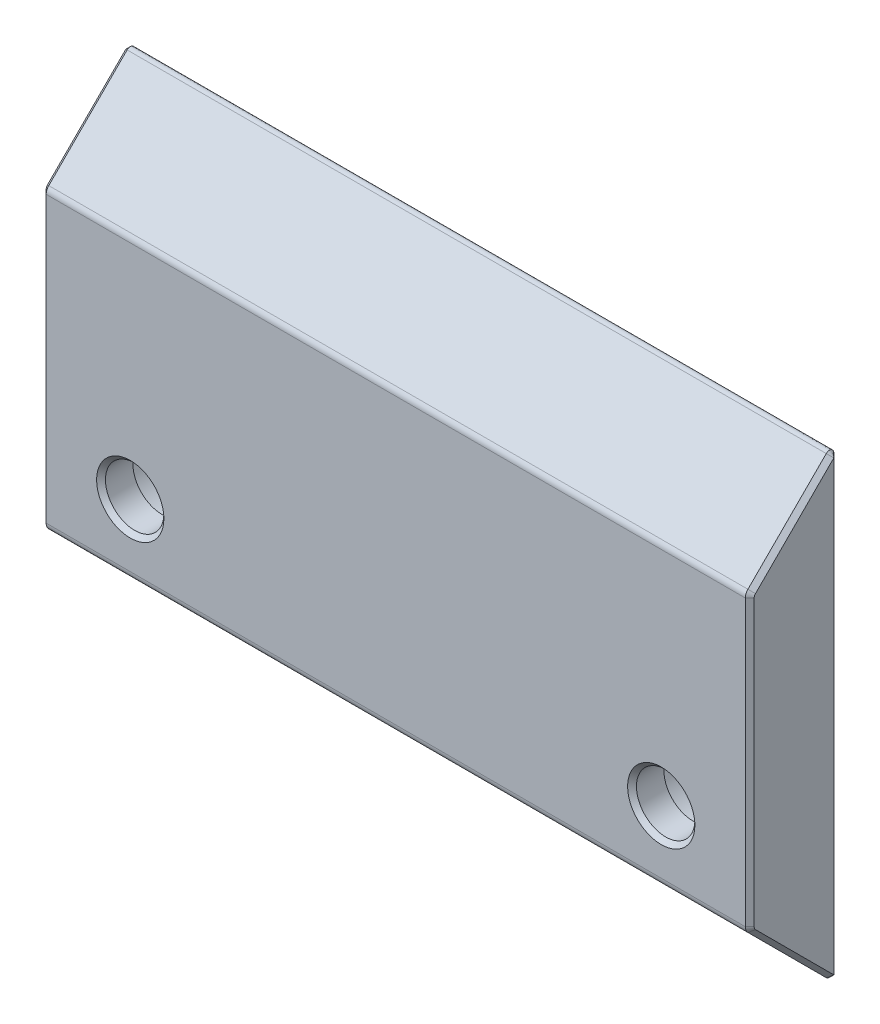
ISO-10303-21;
HEADER;
FILE_DESCRIPTION(('STEP AP214'),'2;1');
FILE_NAME('part.step','',(''),(''),'','','');
FILE_SCHEMA(('AUTOMOTIVE_DESIGN { 1 0 10303 214 1 1 1 1 }'));
ENDSEC;
DATA;
#1=APPLICATION_CONTEXT('core data for automotive mechanical design processes');
#2=APPLICATION_PROTOCOL_DEFINITION('international standard','automotive_design',2000,#1);
#3=PRODUCT_CONTEXT('',#1,'mechanical');
#4=PRODUCT('Part','Part','',(#3));
#5=PRODUCT_RELATED_PRODUCT_CATEGORY('part','',(#4));
#6=PRODUCT_DEFINITION_FORMATION('','',#4);
#7=PRODUCT_DEFINITION_CONTEXT('part definition',#1,'design');
#8=PRODUCT_DEFINITION('design','',#6,#7);
#9=PRODUCT_DEFINITION_SHAPE('','',#8);
#10=(LENGTH_UNIT() NAMED_UNIT(*) SI_UNIT(.MILLI.,.METRE.));
#11=(NAMED_UNIT(*) PLANE_ANGLE_UNIT() SI_UNIT($,.RADIAN.));
#12=(NAMED_UNIT(*) SI_UNIT($,.STERADIAN.) SOLID_ANGLE_UNIT());
#13=UNCERTAINTY_MEASURE_WITH_UNIT(LENGTH_MEASURE(1.E-05),#10,'distance_accuracy_value','');
#14=(GEOMETRIC_REPRESENTATION_CONTEXT(3) GLOBAL_UNCERTAINTY_ASSIGNED_CONTEXT((#13)) GLOBAL_UNIT_ASSIGNED_CONTEXT((#10,
#11,#12)) REPRESENTATION_CONTEXT('',''));
#15=CARTESIAN_POINT('',(0.,0.,0.));
#16=DIRECTION('',(0.,0.,1.));
#17=DIRECTION('',(1.,0.,0.));
#18=AXIS2_PLACEMENT_3D('',#15,#16,#17);
#19=CARTESIAN_POINT('',(80.,10.0000000000001,10.));
#20=DIRECTION('',(0.,0.707106781186544,-0.707106781186551));
#21=DIRECTION('',(0.,0.707106781186551,0.707106781186544));
#22=AXIS2_PLACEMENT_3D('',#19,#20,#21);
#23=PLANE('',#22);
#24=DIRECTION('',(-1.,0.,0.));
#25=VECTOR('',#24,1.);
#26=CARTESIAN_POINT('',(80.,9.70710678118665,9.70710678118655));
#27=LINE('',#26,#25);
#28=CARTESIAN_POINT('',(79.5,9.70710678118665,9.70710678118655));
#29=VERTEX_POINT('',#28);
#30=CARTESIAN_POINT('',(0.5,9.70710678118665,9.70710678118655));
#31=VERTEX_POINT('',#30);
#32=EDGE_CURVE('E155',#29,#31,#27,.T.);
#33=ORIENTED_EDGE('',*,*,#32,.T.);
#34=DIRECTION('',(0.,-0.707106781186551,-0.707106781186544));
#35=VECTOR('',#34,1.);
#36=CARTESIAN_POINT('',(0.500000000000002,0.853553390593286,0.853553390593278));
#37=LINE('',#36,#35);
#38=CARTESIAN_POINT('',(0.5,0.853553390593287,0.853553390593276));
#39=VERTEX_POINT('',#38);
#40=EDGE_CURVE('E171',#31,#39,#37,.T.);
#41=ORIENTED_EDGE('',*,*,#40,.T.);
#42=DIRECTION('',(-1.,0.,0.));
#43=VECTOR('',#42,1.);
#44=CARTESIAN_POINT('',(80.,0.853553390593287,0.853553390593276));
#45=LINE('',#44,#43);
#46=CARTESIAN_POINT('',(79.5,0.853553390593287,0.853553390593276));
#47=VERTEX_POINT('',#46);
#48=EDGE_CURVE('E305',#39,#47,#45,.F.);
#49=ORIENTED_EDGE('',*,*,#48,.T.);
#50=DIRECTION('',(0.,0.707106781186551,0.707106781186544));
#51=VECTOR('',#50,1.);
#52=CARTESIAN_POINT('',(79.5,10.0000000000001,10.));
#53=LINE('',#52,#51);
#54=EDGE_CURVE('E169',#47,#29,#53,.T.);
#55=ORIENTED_EDGE('',*,*,#54,.T.);
#56=EDGE_LOOP('',(#33,#41,#49,#55));
#57=FACE_BOUND('',#56,.T.);
#58=ADVANCED_FACE('F33',(#57),#23,.F.);
#59=CARTESIAN_POINT('',(80.,0.,0.));
#60=DIRECTION('',(0.,0.,1.));
#61=DIRECTION('',(1.,0.,0.));
#62=AXIS2_PLACEMENT_3D('',#59,#60,#61);
#63=PLANE('',#62);
#64=CARTESIAN_POINT('',(70.,17.5,0.));
#65=DIRECTION('',(0.,0.,1.));
#66=DIRECTION('',(1.,0.,0.));
#67=AXIS2_PLACEMENT_3D('',#64,#65,#66);
#68=CIRCLE('',#67,6.00000000000001);
#69=CARTESIAN_POINT('',(76.,17.5,0.));
#70=VERTEX_POINT('',#69);
#71=EDGE_CURVE('E41',#70,#70,#68,.T.);
#72=ORIENTED_EDGE('',*,*,#71,.T.);
#73=EDGE_LOOP('',(#72));
#74=FACE_BOUND('',#73,.T.);
#75=CARTESIAN_POINT('',(10.,17.5,0.));
#76=DIRECTION('',(0.,0.,1.));
#77=DIRECTION('',(1.,0.,0.));
#78=AXIS2_PLACEMENT_3D('',#75,#76,#77);
#79=CIRCLE('',#78,6.00000000000001);
#80=CARTESIAN_POINT('',(16.,17.5,0.));
#81=VERTEX_POINT('',#80);
#82=EDGE_CURVE('E262',#81,#81,#79,.T.);
#83=ORIENTED_EDGE('',*,*,#82,.T.);
#84=EDGE_LOOP('',(#83));
#85=FACE_BOUND('',#84,.T.);
#86=DIRECTION('',(-1.,0.,0.));
#87=VECTOR('',#86,1.);
#88=CARTESIAN_POINT('',(80.,1.20710678118656,0.));
#89=LINE('',#88,#87);
#90=CARTESIAN_POINT('',(79.5,1.20710678118656,0.));
#91=VERTEX_POINT('',#90);
#92=CARTESIAN_POINT('',(0.5,1.20710678118656,0.));
#93=VERTEX_POINT('',#92);
#94=EDGE_CURVE('E299',#91,#93,#89,.T.);
#95=ORIENTED_EDGE('',*,*,#94,.T.);
#96=DIRECTION('',(0.,1.,0.));
#97=VECTOR('',#96,1.);
#98=CARTESIAN_POINT('',(0.5,51.7928932188134,0.));
#99=LINE('',#98,#97);
#100=CARTESIAN_POINT('',(0.5,51.7928932188134,0.));
#101=VERTEX_POINT('',#100);
#102=EDGE_CURVE('E179',#93,#101,#99,.T.);
#103=ORIENTED_EDGE('',*,*,#102,.T.);
#104=DIRECTION('',(-1.,0.,0.));
#105=VECTOR('',#104,1.);
#106=CARTESIAN_POINT('',(80.,51.7928932188134,0.));
#107=LINE('',#106,#105);
#108=CARTESIAN_POINT('',(79.5,51.7928932188134,0.));
#109=VERTEX_POINT('',#108);
#110=EDGE_CURVE('E302',#101,#109,#107,.F.);
#111=ORIENTED_EDGE('',*,*,#110,.T.);
#112=DIRECTION('',(0.,-1.,0.));
#113=VECTOR('',#112,1.);
#114=CARTESIAN_POINT('',(79.5,0.,0.));
#115=LINE('',#114,#113);
#116=EDGE_CURVE('E177',#109,#91,#115,.T.);
#117=ORIENTED_EDGE('',*,*,#116,.T.);
#118=EDGE_LOOP('',(#95,#103,#111,#117));
#119=FACE_BOUND('',#118,.T.);
#120=ADVANCED_FACE('F267',(#74,#85,#119),#63,.F.);
#121=CARTESIAN_POINT('',(80.,53.,0.));
#122=DIRECTION('',(0.,-0.707106781186544,-0.707106781186552));
#123=DIRECTION('',(0.,0.707106781186551,-0.707106781186544));
#124=AXIS2_PLACEMENT_3D('',#121,#122,#123);
#125=PLANE('',#124);
#126=DIRECTION('',(-1.,0.,0.));
#127=VECTOR('',#126,1.);
#128=CARTESIAN_POINT('',(80.,52.1464466094067,0.853553390593277));
#129=LINE('',#128,#127);
#130=CARTESIAN_POINT('',(79.5,52.1464466094067,0.853553390593277));
#131=VERTEX_POINT('',#130);
#132=CARTESIAN_POINT('',(0.5,52.1464466094067,0.853553390593277));
#133=VERTEX_POINT('',#132);
#134=EDGE_CURVE('E296',#131,#133,#129,.T.);
#135=ORIENTED_EDGE('',*,*,#134,.T.);
#136=DIRECTION('',(0.,-0.707106781186551,0.707106781186544));
#137=VECTOR('',#136,1.);
#138=CARTESIAN_POINT('',(0.500000000000001,43.2928932188133,9.70710678118656));
#139=LINE('',#138,#137);
#140=CARTESIAN_POINT('',(0.5,43.2928932188133,9.70710678118656));
#141=VERTEX_POINT('',#140);
#142=EDGE_CURVE('E188',#133,#141,#139,.T.);
#143=ORIENTED_EDGE('',*,*,#142,.T.);
#144=DIRECTION('',(-1.,0.,0.));
#145=VECTOR('',#144,1.);
#146=CARTESIAN_POINT('',(80.,43.2928932188133,9.70710678118656));
#147=LINE('',#146,#145);
#148=CARTESIAN_POINT('',(79.5,43.2928932188133,9.70710678118656));
#149=VERTEX_POINT('',#148);
#150=EDGE_CURVE('E314',#141,#149,#147,.F.);
#151=ORIENTED_EDGE('',*,*,#150,.T.);
#152=DIRECTION('',(0.,0.707106781186551,-0.707106781186544));
#153=VECTOR('',#152,1.);
#154=CARTESIAN_POINT('',(79.5,53.,0.));
#155=LINE('',#154,#153);
#156=EDGE_CURVE('E186',#149,#131,#155,.T.);
#157=ORIENTED_EDGE('',*,*,#156,.T.);
#158=EDGE_LOOP('',(#135,#143,#151,#157));
#159=FACE_BOUND('',#158,.T.);
#160=ADVANCED_FACE('F368',(#159),#125,.F.);
#161=CARTESIAN_POINT('',(80.,42.9999999999999,10.));
#162=DIRECTION('',(0.,0.,-1.));
#163=DIRECTION('',(0.,1.,0.));
#164=AXIS2_PLACEMENT_3D('',#161,#162,#163);
#165=PLANE('',#164);
#166=CARTESIAN_POINT('',(10.,17.5,10.));
#167=DIRECTION('',(0.,0.,-1.));
#168=DIRECTION('',(0.,1.,0.));
#169=AXIS2_PLACEMENT_3D('',#166,#167,#168);
#170=CIRCLE('',#169,3.79999999999999);
#171=CARTESIAN_POINT('',(10.,21.3,10.));
#172=VERTEX_POINT('',#171);
#173=EDGE_CURVE('E197',#172,#172,#170,.T.);
#174=ORIENTED_EDGE('',*,*,#173,.T.);
#175=EDGE_LOOP('',(#174));
#176=FACE_BOUND('',#175,.T.);
#177=CARTESIAN_POINT('',(70.,17.5,10.));
#178=DIRECTION('',(0.,0.,-1.));
#179=DIRECTION('',(0.,1.,0.));
#180=AXIS2_PLACEMENT_3D('',#177,#178,#179);
#181=CIRCLE('',#180,3.8);
#182=CARTESIAN_POINT('',(70.,21.3,10.));
#183=VERTEX_POINT('',#182);
#184=EDGE_CURVE('E194',#183,#183,#181,.T.);
#185=ORIENTED_EDGE('',*,*,#184,.T.);
#186=EDGE_LOOP('',(#185));
#187=FACE_BOUND('',#186,.T.);
#188=DIRECTION('',(-1.,0.,0.));
#189=VECTOR('',#188,1.);
#190=CARTESIAN_POINT('',(80.,42.5857864376268,10.));
#191=LINE('',#190,#189);
#192=CARTESIAN_POINT('',(79.5,42.5857864376268,10.));
#193=VERTEX_POINT('',#192);
#194=CARTESIAN_POINT('',(0.5,42.5857864376268,10.));
#195=VERTEX_POINT('',#194);
#196=EDGE_CURVE('E311',#193,#195,#191,.T.);
#197=ORIENTED_EDGE('',*,*,#196,.T.);
#198=DIRECTION('',(0.,-1.,0.));
#199=VECTOR('',#198,1.);
#200=CARTESIAN_POINT('',(0.5,10.4142135623732,10.));
#201=LINE('',#200,#199);
#202=CARTESIAN_POINT('',(0.5,10.4142135623732,10.));
#203=VERTEX_POINT('',#202);
#204=EDGE_CURVE('E202',#195,#203,#201,.T.);
#205=ORIENTED_EDGE('',*,*,#204,.T.);
#206=DIRECTION('',(-1.,0.,0.));
#207=VECTOR('',#206,1.);
#208=CARTESIAN_POINT('',(80.,10.4142135623732,10.));
#209=LINE('',#208,#207);
#210=CARTESIAN_POINT('',(79.5,10.4142135623732,10.));
#211=VERTEX_POINT('',#210);
#212=EDGE_CURVE('E308',#203,#211,#209,.F.);
#213=ORIENTED_EDGE('',*,*,#212,.T.);
#214=DIRECTION('',(0.,1.,0.));
#215=VECTOR('',#214,1.);
#216=CARTESIAN_POINT('',(79.5,42.9999999999999,10.));
#217=LINE('',#216,#215);
#218=EDGE_CURVE('E200',#211,#193,#217,.T.);
#219=ORIENTED_EDGE('',*,*,#218,.T.);
#220=EDGE_LOOP('',(#197,#205,#213,#219));
#221=FACE_BOUND('',#220,.T.);
#222=ADVANCED_FACE('F400',(#176,#187,#221),#165,.F.);
#223=CARTESIAN_POINT('',(80.,0.,0.));
#224=DIRECTION('',(-1.,0.,0.));
#225=DIRECTION('',(0.,0.,1.));
#226=AXIS2_PLACEMENT_3D('',#223,#224,#225);
#227=PLANE('',#226);
#228=DIRECTION('',(0.,-0.707106781186551,-0.707106781186544));
#229=VECTOR('',#228,1.);
#230=CARTESIAN_POINT('',(80.,0.353553390593278,-0.353553390593281));
#231=LINE('',#230,#229);
#232=CARTESIAN_POINT('',(80.,10.0606601717799,9.35355339059327));
#233=VERTEX_POINT('',#232);
#234=CARTESIAN_POINT('',(80.,1.20710678118656,0.499999999999995));
#235=VERTEX_POINT('',#234);
#236=EDGE_CURVE('E48',#233,#235,#231,.T.);
#237=ORIENTED_EDGE('',*,*,#236,.T.);
#238=DIRECTION('',(0.,1.,0.));
#239=VECTOR('',#238,1.);
#240=CARTESIAN_POINT('',(80.,0.,0.500000000000009));
#241=LINE('',#240,#239);
#242=CARTESIAN_POINT('',(80.,51.7928932188134,0.499999999999995));
#243=VERTEX_POINT('',#242);
#244=EDGE_CURVE('E212',#235,#243,#241,.T.);
#245=ORIENTED_EDGE('',*,*,#244,.T.);
#246=DIRECTION('',(0.,-0.707106781186551,0.707106781186544));
#247=VECTOR('',#246,1.);
#248=CARTESIAN_POINT('',(80.,26.1464466094064,26.1464466094067));
#249=LINE('',#248,#247);
#250=CARTESIAN_POINT('',(80.,42.9393398282201,9.35355339059327));
#251=VERTEX_POINT('',#250);
#252=EDGE_CURVE('E204',#243,#251,#249,.T.);
#253=ORIENTED_EDGE('',*,*,#252,.T.);
#254=CARTESIAN_POINT('',(80.,42.5857864376268,9.));
#255=DIRECTION('',(-1.,0.,0.));
#256=DIRECTION('',(0.,0.,1.));
#257=AXIS2_PLACEMENT_3D('',#254,#255,#256);
#258=CIRCLE('',#257,0.499999999999992);
#259=CARTESIAN_POINT('',(80.,42.5857864376268,9.49999999999999));
#260=VERTEX_POINT('',#259);
#261=EDGE_CURVE('E206',#251,#260,#258,.F.);
#262=ORIENTED_EDGE('',*,*,#261,.T.);
#263=DIRECTION('',(0.,-1.,0.));
#264=VECTOR('',#263,1.);
#265=CARTESIAN_POINT('',(80.,0.,9.49999999999999));
#266=LINE('',#265,#264);
#267=CARTESIAN_POINT('',(80.,10.4142135623732,9.49999999999999));
#268=VERTEX_POINT('',#267);
#269=EDGE_CURVE('E208',#260,#268,#266,.T.);
#270=ORIENTED_EDGE('',*,*,#269,.T.);
#271=CARTESIAN_POINT('',(80.,10.4142135623732,9.));
#272=DIRECTION('',(-1.,0.,0.));
#273=DIRECTION('',(0.,0.,1.));
#274=AXIS2_PLACEMENT_3D('',#271,#272,#273);
#275=CIRCLE('',#274,0.499999999999992);
#276=EDGE_CURVE('E53',#268,#233,#275,.F.);
#277=ORIENTED_EDGE('',*,*,#276,.T.);
#278=EDGE_LOOP('',(#237,#245,#253,#262,#270,#277));
#279=FACE_BOUND('',#278,.T.);
#280=ADVANCED_FACE('F354',(#279),#227,.F.);
#281=CARTESIAN_POINT('',(0.,0.,0.));
#282=DIRECTION('',(-1.,0.,0.));
#283=DIRECTION('',(0.,0.,1.));
#284=AXIS2_PLACEMENT_3D('',#281,#282,#283);
#285=PLANE('',#284);
#286=DIRECTION('',(0.,0.707106781186551,0.707106781186544));
#287=VECTOR('',#286,1.);
#288=CARTESIAN_POINT('',(0.,10.0606601717799,9.35355339059327));
#289=LINE('',#288,#287);
#290=CARTESIAN_POINT('',(0.,1.20710678118656,0.5));
#291=VERTEX_POINT('',#290);
#292=CARTESIAN_POINT('',(0.,10.0606601717799,9.35355339059327));
#293=VERTEX_POINT('',#292);
#294=EDGE_CURVE('E159',#291,#293,#289,.T.);
#295=ORIENTED_EDGE('',*,*,#294,.T.);
#296=CARTESIAN_POINT('',(0.,10.4142135623732,9.));
#297=DIRECTION('',(-1.,0.,0.));
#298=DIRECTION('',(0.,0.,1.));
#299=AXIS2_PLACEMENT_3D('',#296,#297,#298);
#300=CIRCLE('',#299,0.499999999999999);
#301=CARTESIAN_POINT('',(0.,10.4142135623732,9.5));
#302=VERTEX_POINT('',#301);
#303=EDGE_CURVE('E139',#293,#302,#300,.T.);
#304=ORIENTED_EDGE('',*,*,#303,.T.);
#305=DIRECTION('',(0.,1.,0.));
#306=VECTOR('',#305,1.);
#307=CARTESIAN_POINT('',(0.,42.5857864376268,9.5));
#308=LINE('',#307,#306);
#309=CARTESIAN_POINT('',(0.,42.5857864376268,9.5));
#310=VERTEX_POINT('',#309);
#311=EDGE_CURVE('E148',#302,#310,#308,.T.);
#312=ORIENTED_EDGE('',*,*,#311,.T.);
#313=CARTESIAN_POINT('',(0.,42.5857864376268,9.));
#314=DIRECTION('',(-1.,0.,0.));
#315=DIRECTION('',(0.,0.,1.));
#316=AXIS2_PLACEMENT_3D('',#313,#314,#315);
#317=CIRCLE('',#316,0.500000000000001);
#318=CARTESIAN_POINT('',(0.,42.9393398282201,9.35355339059328));
#319=VERTEX_POINT('',#318);
#320=EDGE_CURVE('E154',#310,#319,#317,.T.);
#321=ORIENTED_EDGE('',*,*,#320,.T.);
#322=DIRECTION('',(0.,0.707106781186551,-0.707106781186544));
#323=VECTOR('',#322,1.);
#324=CARTESIAN_POINT('',(0.,51.7928932188134,0.499999999999999));
#325=LINE('',#324,#323);
#326=CARTESIAN_POINT('',(0.,51.7928932188134,0.5));
#327=VERTEX_POINT('',#326);
#328=EDGE_CURVE('E320',#319,#327,#325,.T.);
#329=ORIENTED_EDGE('',*,*,#328,.T.);
#330=DIRECTION('',(0.,-1.,0.));
#331=VECTOR('',#330,1.);
#332=CARTESIAN_POINT('',(0.,1.20710678118656,0.5));
#333=LINE('',#332,#331);
#334=EDGE_CURVE('E164',#327,#291,#333,.T.);
#335=ORIENTED_EDGE('',*,*,#334,.T.);
#336=EDGE_LOOP('',(#295,#304,#312,#321,#329,#335));
#337=FACE_BOUND('',#336,.T.);
#338=ADVANCED_FACE('F157',(#337),#285,.T.);
#339=CARTESIAN_POINT('',(10.,17.5,0.));
#340=DIRECTION('',(0.,0.,-1.));
#341=DIRECTION('',(-1.,0.,0.));
#342=AXIS2_PLACEMENT_3D('',#339,#340,#341);
#343=CYLINDRICAL_SURFACE('',#342,3.3);
#344=CARTESIAN_POINT('',(10.,17.5,9.5));
#345=DIRECTION('',(0.,0.,-1.));
#346=DIRECTION('',(-1.,0.,0.));
#347=AXIS2_PLACEMENT_3D('',#344,#345,#346);
#348=CIRCLE('',#347,3.3);
#349=CARTESIAN_POINT('',(6.70000000000001,17.5,9.5));
#350=VERTEX_POINT('',#349);
#351=EDGE_CURVE('E214',#350,#350,#348,.F.);
#352=ORIENTED_EDGE('',*,*,#351,.T.);
#353=EDGE_LOOP('',(#352));
#354=FACE_BOUND('',#353,.T.);
#355=CARTESIAN_POINT('',(10.,17.5,6.4));
#356=DIRECTION('',(0.,0.,-1.));
#357=DIRECTION('',(-1.,0.,0.));
#358=AXIS2_PLACEMENT_3D('',#355,#356,#357);
#359=CIRCLE('',#358,3.3);
#360=CARTESIAN_POINT('',(6.70000000000001,17.5,6.4));
#361=VERTEX_POINT('',#360);
#362=EDGE_CURVE('E293',#361,#361,#359,.T.);
#363=ORIENTED_EDGE('',*,*,#362,.T.);
#364=EDGE_LOOP('',(#363));
#365=FACE_BOUND('',#364,.T.);
#366=ADVANCED_FACE('F406',(#354,#365),#343,.F.);
#367=CARTESIAN_POINT('',(13.3,17.5,6.4));
#368=DIRECTION('',(0.,0.,1.));
#369=DIRECTION('',(1.,0.,0.));
#370=AXIS2_PLACEMENT_3D('',#367,#368,#369);
#371=PLANE('',#370);
#372=ORIENTED_EDGE('',*,*,#362,.F.);
#373=EDGE_LOOP('',(#372));
#374=FACE_BOUND('',#373,.T.);
#375=CARTESIAN_POINT('',(10.,17.5,6.4));
#376=DIRECTION('',(0.,0.,-1.));
#377=DIRECTION('',(-1.,0.,0.));
#378=AXIS2_PLACEMENT_3D('',#375,#376,#377);
#379=CIRCLE('',#378,5.5);
#380=CARTESIAN_POINT('',(4.50000000000001,17.5,6.4));
#381=VERTEX_POINT('',#380);
#382=EDGE_CURVE('E288',#381,#381,#379,.T.);
#383=ORIENTED_EDGE('',*,*,#382,.T.);
#384=EDGE_LOOP('',(#383));
#385=FACE_BOUND('',#384,.T.);
#386=ADVANCED_FACE('F411',(#374,#385),#371,.F.);
#387=CARTESIAN_POINT('',(10.,17.5,0.));
#388=DIRECTION('',(0.,0.,-1.));
#389=DIRECTION('',(-1.,0.,0.));
#390=AXIS2_PLACEMENT_3D('',#387,#388,#389);
#391=CYLINDRICAL_SURFACE('',#390,5.5);
#392=CARTESIAN_POINT('',(10.,17.5,0.500000000000013));
#393=DIRECTION('',(0.,0.,1.));
#394=DIRECTION('',(1.,0.,0.));
#395=AXIS2_PLACEMENT_3D('',#392,#393,#394);
#396=CIRCLE('',#395,5.5);
#397=CARTESIAN_POINT('',(15.5,17.5,0.500000000000013));
#398=VERTEX_POINT('',#397);
#399=EDGE_CURVE('E11',#398,#398,#396,.F.);
#400=ORIENTED_EDGE('',*,*,#399,.T.);
#401=EDGE_LOOP('',(#400));
#402=FACE_BOUND('',#401,.T.);
#403=ORIENTED_EDGE('',*,*,#382,.F.);
#404=EDGE_LOOP('',(#403));
#405=FACE_BOUND('',#404,.T.);
#406=ADVANCED_FACE('F415',(#402,#405),#391,.F.);
#407=CARTESIAN_POINT('',(70.,17.5,0.));
#408=DIRECTION('',(0.,0.,-1.));
#409=DIRECTION('',(-1.,0.,0.));
#410=AXIS2_PLACEMENT_3D('',#407,#408,#409);
#411=CYLINDRICAL_SURFACE('',#410,3.3);
#412=CARTESIAN_POINT('',(70.,17.5,9.50000000000001));
#413=DIRECTION('',(0.,0.,-1.));
#414=DIRECTION('',(-1.,0.,0.));
#415=AXIS2_PLACEMENT_3D('',#412,#413,#414);
#416=CIRCLE('',#415,3.3);
#417=CARTESIAN_POINT('',(66.7,17.5,9.50000000000001));
#418=VERTEX_POINT('',#417);
#419=EDGE_CURVE('E217',#418,#418,#416,.F.);
#420=ORIENTED_EDGE('',*,*,#419,.T.);
#421=EDGE_LOOP('',(#420));
#422=FACE_BOUND('',#421,.T.);
#423=CARTESIAN_POINT('',(70.,17.5,6.4));
#424=DIRECTION('',(0.,0.,-1.));
#425=DIRECTION('',(-1.,0.,0.));
#426=AXIS2_PLACEMENT_3D('',#423,#424,#425);
#427=CIRCLE('',#426,3.3);
#428=CARTESIAN_POINT('',(66.7,17.5,6.4));
#429=VERTEX_POINT('',#428);
#430=EDGE_CURVE('E285',#429,#429,#427,.T.);
#431=ORIENTED_EDGE('',*,*,#430,.T.);
#432=EDGE_LOOP('',(#431));
#433=FACE_BOUND('',#432,.T.);
#434=ADVANCED_FACE('F419',(#422,#433),#411,.F.);
#435=CARTESIAN_POINT('',(73.3,17.5,6.4));
#436=DIRECTION('',(0.,0.,1.));
#437=DIRECTION('',(1.,0.,0.));
#438=AXIS2_PLACEMENT_3D('',#435,#436,#437);
#439=PLANE('',#438);
#440=ORIENTED_EDGE('',*,*,#430,.F.);
#441=EDGE_LOOP('',(#440));
#442=FACE_BOUND('',#441,.T.);
#443=CARTESIAN_POINT('',(70.,17.5,6.4));
#444=DIRECTION('',(0.,0.,-1.));
#445=DIRECTION('',(-1.,0.,0.));
#446=AXIS2_PLACEMENT_3D('',#443,#444,#445);
#447=CIRCLE('',#446,5.50000000000001);
#448=CARTESIAN_POINT('',(64.5,17.5,6.4));
#449=VERTEX_POINT('',#448);
#450=EDGE_CURVE('E238',#449,#449,#447,.T.);
#451=ORIENTED_EDGE('',*,*,#450,.T.);
#452=EDGE_LOOP('',(#451));
#453=FACE_BOUND('',#452,.T.);
#454=ADVANCED_FACE('F280',(#442,#453),#439,.F.);
#455=CARTESIAN_POINT('',(70.,17.5,0.));
#456=DIRECTION('',(0.,0.,-1.));
#457=DIRECTION('',(-1.,0.,0.));
#458=AXIS2_PLACEMENT_3D('',#455,#456,#457);
#459=CYLINDRICAL_SURFACE('',#458,5.50000000000001);
#460=CARTESIAN_POINT('',(70.,17.5,0.500000000000006));
#461=DIRECTION('',(0.,0.,1.));
#462=DIRECTION('',(1.,0.,0.));
#463=AXIS2_PLACEMENT_3D('',#460,#461,#462);
#464=CIRCLE('',#463,5.50000000000001);
#465=CARTESIAN_POINT('',(75.5,17.5,0.500000000000006));
#466=VERTEX_POINT('',#465);
#467=EDGE_CURVE('E219',#466,#466,#464,.F.);
#468=ORIENTED_EDGE('',*,*,#467,.T.);
#469=EDGE_LOOP('',(#468));
#470=FACE_BOUND('',#469,.T.);
#471=ORIENTED_EDGE('',*,*,#450,.F.);
#472=EDGE_LOOP('',(#471));
#473=FACE_BOUND('',#472,.T.);
#474=ADVANCED_FACE('F276',(#470,#473),#459,.F.);
#475=CARTESIAN_POINT('',(80.,51.7928932188134,0.5));
#476=DIRECTION('',(-1.,0.,0.));
#477=DIRECTION('',(0.,0.,1.));
#478=AXIS2_PLACEMENT_3D('',#475,#476,#477);
#479=CYLINDRICAL_SURFACE('',#478,0.5);
#480=ORIENTED_EDGE('',*,*,#110,.F.);
#481=CARTESIAN_POINT('',(0.5,51.7928932188134,0.5));
#482=DIRECTION('',(-1.,0.,0.));
#483=DIRECTION('',(0.,0.,1.));
#484=AXIS2_PLACEMENT_3D('',#481,#482,#483);
#485=CIRCLE('',#484,0.5);
#486=EDGE_CURVE('E184',#101,#133,#485,.F.);
#487=ORIENTED_EDGE('',*,*,#486,.T.);
#488=ORIENTED_EDGE('',*,*,#134,.F.);
#489=CARTESIAN_POINT('',(79.5,51.7928932188134,0.5));
#490=DIRECTION('',(-1.,0.,0.));
#491=DIRECTION('',(0.,0.,1.));
#492=AXIS2_PLACEMENT_3D('',#489,#490,#491);
#493=CIRCLE('',#492,0.5);
#494=EDGE_CURVE('E181',#131,#109,#493,.T.);
#495=ORIENTED_EDGE('',*,*,#494,.T.);
#496=EDGE_LOOP('',(#480,#487,#488,#495));
#497=FACE_BOUND('',#496,.T.);
#498=ADVANCED_FACE('F279',(#497),#479,.T.);
#499=CARTESIAN_POINT('',(80.,1.20710678118656,0.5));
#500=DIRECTION('',(-1.,0.,0.));
#501=DIRECTION('',(0.,0.,1.));
#502=AXIS2_PLACEMENT_3D('',#499,#500,#501);
#503=CYLINDRICAL_SURFACE('',#502,0.5);
#504=ORIENTED_EDGE('',*,*,#48,.F.);
#505=CARTESIAN_POINT('',(0.5,1.20710678118656,0.5));
#506=DIRECTION('',(-1.,0.,0.));
#507=DIRECTION('',(0.,0.,1.));
#508=AXIS2_PLACEMENT_3D('',#505,#506,#507);
#509=CIRCLE('',#508,0.5);
#510=EDGE_CURVE('E175',#39,#93,#509,.F.);
#511=ORIENTED_EDGE('',*,*,#510,.T.);
#512=ORIENTED_EDGE('',*,*,#94,.F.);
#513=CARTESIAN_POINT('',(79.5,1.20710678118656,0.5));
#514=DIRECTION('',(-1.,0.,0.));
#515=DIRECTION('',(0.,0.,1.));
#516=AXIS2_PLACEMENT_3D('',#513,#514,#515);
#517=CIRCLE('',#516,0.5);
#518=EDGE_CURVE('E173',#91,#47,#517,.T.);
#519=ORIENTED_EDGE('',*,*,#518,.T.);
#520=EDGE_LOOP('',(#504,#511,#512,#519));
#521=FACE_BOUND('',#520,.T.);
#522=ADVANCED_FACE('F380',(#521),#503,.T.);
#523=CARTESIAN_POINT('',(80.,42.5857864376268,9.));
#524=DIRECTION('',(-1.,0.,0.));
#525=DIRECTION('',(0.,0.,1.));
#526=AXIS2_PLACEMENT_3D('',#523,#524,#525);
#527=CYLINDRICAL_SURFACE('',#526,1.);
#528=ORIENTED_EDGE('',*,*,#150,.F.);
#529=CARTESIAN_POINT('',(0.5,42.5857864376268,9.));
#530=DIRECTION('',(-1.,0.,0.));
#531=DIRECTION('',(0.,0.,1.));
#532=AXIS2_PLACEMENT_3D('',#529,#530,#531);
#533=CIRCLE('',#532,1.);
#534=EDGE_CURVE('E192',#141,#195,#533,.F.);
#535=ORIENTED_EDGE('',*,*,#534,.T.);
#536=ORIENTED_EDGE('',*,*,#196,.F.);
#537=CARTESIAN_POINT('',(79.5,42.5857864376268,9.));
#538=DIRECTION('',(-1.,0.,0.));
#539=DIRECTION('',(0.,0.,1.));
#540=AXIS2_PLACEMENT_3D('',#537,#538,#539);
#541=CIRCLE('',#540,1.);
#542=EDGE_CURVE('E190',#193,#149,#541,.T.);
#543=ORIENTED_EDGE('',*,*,#542,.T.);
#544=EDGE_LOOP('',(#528,#535,#536,#543));
#545=FACE_BOUND('',#544,.T.);
#546=ADVANCED_FACE('F382',(#545),#527,.T.);
#547=CARTESIAN_POINT('',(80.,10.4142135623732,9.));
#548=DIRECTION('',(-1.,0.,0.));
#549=DIRECTION('',(0.,0.,1.));
#550=AXIS2_PLACEMENT_3D('',#547,#548,#549);
#551=CYLINDRICAL_SURFACE('',#550,1.);
#552=ORIENTED_EDGE('',*,*,#212,.F.);
#553=CARTESIAN_POINT('',(0.5,10.4142135623732,9.));
#554=DIRECTION('',(-1.,0.,0.));
#555=DIRECTION('',(0.,0.,1.));
#556=AXIS2_PLACEMENT_3D('',#553,#554,#555);
#557=CIRCLE('',#556,1.);
#558=EDGE_CURVE('E141',#203,#31,#557,.F.);
#559=ORIENTED_EDGE('',*,*,#558,.T.);
#560=ORIENTED_EDGE('',*,*,#32,.F.);
#561=CARTESIAN_POINT('',(79.5,10.4142135623732,9.));
#562=DIRECTION('',(-1.,0.,0.));
#563=DIRECTION('',(0.,0.,1.));
#564=AXIS2_PLACEMENT_3D('',#561,#562,#563);
#565=CIRCLE('',#564,1.);
#566=EDGE_CURVE('E161',#29,#211,#565,.T.);
#567=ORIENTED_EDGE('',*,*,#566,.T.);
#568=EDGE_LOOP('',(#552,#559,#560,#567));
#569=FACE_BOUND('',#568,.T.);
#570=ADVANCED_FACE('F339',(#569),#551,.T.);
#571=CARTESIAN_POINT('',(0.5,51.7928932188134,0.5));
#572=DIRECTION('',(1.,0.,0.));
#573=DIRECTION('',(0.,0.,-1.));
#574=AXIS2_PLACEMENT_3D('',#571,#572,#573);
#575=CONICAL_SURFACE('',#574,0.5,0.785398163397448);
#576=DIRECTION('',(-0.707106781186548,-0.499999999999998,-0.500000000000002));
#577=VECTOR('',#576,1.);
#578=CARTESIAN_POINT('',(0.5,52.1464466094067,0.853553390593276));
#579=LINE('',#578,#577);
#580=EDGE_CURVE('E232',#133,#327,#579,.T.);
#581=ORIENTED_EDGE('',*,*,#580,.F.);
#582=ORIENTED_EDGE('',*,*,#486,.F.);
#583=DIRECTION('',(0.707106781186547,0.,-0.707106781186547));
#584=VECTOR('',#583,1.);
#585=CARTESIAN_POINT('',(0.,51.7928932188134,0.5));
#586=LINE('',#585,#584);
#587=EDGE_CURVE('E235',#327,#101,#586,.T.);
#588=ORIENTED_EDGE('',*,*,#587,.F.);
#589=EDGE_LOOP('',(#581,#582,#588));
#590=FACE_BOUND('',#589,.T.);
#591=ADVANCED_FACE('F465',(#590),#575,.T.);
#592=CARTESIAN_POINT('',(0.5,0.,0.));
#593=DIRECTION('',(-0.707106781186547,0.,-0.707106781186547));
#594=DIRECTION('',(0.,-1.,0.));
#595=AXIS2_PLACEMENT_3D('',#592,#593,#594);
#596=PLANE('',#595);
#597=ORIENTED_EDGE('',*,*,#587,.T.);
#598=ORIENTED_EDGE('',*,*,#102,.F.);
#599=DIRECTION('',(0.707106781186547,0.,-0.707106781186547));
#600=VECTOR('',#599,1.);
#601=CARTESIAN_POINT('',(0.,1.20710678118656,0.5));
#602=LINE('',#601,#600);
#603=EDGE_CURVE('E229',#291,#93,#602,.T.);
#604=ORIENTED_EDGE('',*,*,#603,.F.);
#605=ORIENTED_EDGE('',*,*,#334,.F.);
#606=EDGE_LOOP('',(#597,#598,#604,#605));
#607=FACE_BOUND('',#606,.T.);
#608=ADVANCED_FACE('F327',(#607),#596,.T.);
#609=CARTESIAN_POINT('',(0.5,53.,0.));
#610=DIRECTION('',(-0.70710678118655,0.499999999999995,0.500000000000001));
#611=DIRECTION('',(0.,0.707106781186551,-0.707106781186544));
#612=AXIS2_PLACEMENT_3D('',#609,#610,#611);
#613=PLANE('',#612);
#614=ORIENTED_EDGE('',*,*,#580,.T.);
#615=ORIENTED_EDGE('',*,*,#328,.F.);
#616=DIRECTION('',(-0.707106781186547,-0.499999999999997,-0.500000000000004));
#617=VECTOR('',#616,1.);
#618=CARTESIAN_POINT('',(0.500000000000001,43.2928932188133,9.70710678118656));
#619=LINE('',#618,#617);
#620=EDGE_CURVE('E226',#141,#319,#619,.T.);
#621=ORIENTED_EDGE('',*,*,#620,.F.);
#622=ORIENTED_EDGE('',*,*,#142,.F.);
#623=EDGE_LOOP('',(#614,#615,#621,#622));
#624=FACE_BOUND('',#623,.T.);
#625=ADVANCED_FACE('F483',(#624),#613,.T.);
#626=CARTESIAN_POINT('',(0.5,1.20710678118656,0.5));
#627=DIRECTION('',(1.,0.,0.));
#628=DIRECTION('',(0.,0.,-1.));
#629=AXIS2_PLACEMENT_3D('',#626,#627,#628);
#630=CONICAL_SURFACE('',#629,0.5,0.785398163397448);
#631=ORIENTED_EDGE('',*,*,#603,.T.);
#632=ORIENTED_EDGE('',*,*,#510,.F.);
#633=DIRECTION('',(0.707106781186549,-0.499999999999997,0.500000000000002));
#634=VECTOR('',#633,1.);
#635=CARTESIAN_POINT('',(0.,1.20710678118656,0.500000000000001));
#636=LINE('',#635,#634);
#637=EDGE_CURVE('E223',#291,#39,#636,.T.);
#638=ORIENTED_EDGE('',*,*,#637,.F.);
#639=EDGE_LOOP('',(#631,#632,#638));
#640=FACE_BOUND('',#639,.T.);
#641=ADVANCED_FACE('F330',(#640),#630,.T.);
#642=CARTESIAN_POINT('',(0.,42.5857864376268,9.));
#643=DIRECTION('',(1.,0.,0.));
#644=DIRECTION('',(0.,0.,-1.));
#645=AXIS2_PLACEMENT_3D('',#642,#643,#644);
#646=CONICAL_SURFACE('',#645,0.5,0.785398163397447);
#647=ORIENTED_EDGE('',*,*,#620,.T.);
#648=ORIENTED_EDGE('',*,*,#320,.F.);
#649=DIRECTION('',(-0.707106781186547,0.,-0.707106781186547));
#650=VECTOR('',#649,1.);
#651=CARTESIAN_POINT('',(0.5,42.5857864376268,10.));
#652=LINE('',#651,#650);
#653=EDGE_CURVE('E151',#195,#310,#652,.T.);
#654=ORIENTED_EDGE('',*,*,#653,.F.);
#655=ORIENTED_EDGE('',*,*,#534,.F.);
#656=EDGE_LOOP('',(#647,#648,#654,#655));
#657=FACE_BOUND('',#656,.T.);
#658=ADVANCED_FACE('F501',(#657),#646,.T.);
#659=CARTESIAN_POINT('',(0.5,10.0000000000001,10.));
#660=DIRECTION('',(-0.707106781186547,-0.499999999999997,0.500000000000003));
#661=DIRECTION('',(0.,0.707106781186551,0.707106781186544));
#662=AXIS2_PLACEMENT_3D('',#659,#660,#661);
#663=PLANE('',#662);
#664=ORIENTED_EDGE('',*,*,#637,.T.);
#665=ORIENTED_EDGE('',*,*,#40,.F.);
#666=DIRECTION('',(0.707106781186549,-0.499999999999997,0.500000000000002));
#667=VECTOR('',#666,1.);
#668=CARTESIAN_POINT('',(0.,10.0606601717799,9.35355339059327));
#669=LINE('',#668,#667);
#670=EDGE_CURVE('E144',#293,#31,#669,.T.);
#671=ORIENTED_EDGE('',*,*,#670,.F.);
#672=ORIENTED_EDGE('',*,*,#294,.F.);
#673=EDGE_LOOP('',(#664,#665,#671,#672));
#674=FACE_BOUND('',#673,.T.);
#675=ADVANCED_FACE('F333',(#674),#663,.T.);
#676=CARTESIAN_POINT('',(0.5,42.9999999999999,10.));
#677=DIRECTION('',(-0.707106781186548,0.,0.707106781186547));
#678=DIRECTION('',(0.,1.,0.));
#679=AXIS2_PLACEMENT_3D('',#676,#677,#678);
#680=PLANE('',#679);
#681=ORIENTED_EDGE('',*,*,#653,.T.);
#682=ORIENTED_EDGE('',*,*,#311,.F.);
#683=DIRECTION('',(-0.707106781186547,0.,-0.707106781186547));
#684=VECTOR('',#683,1.);
#685=CARTESIAN_POINT('',(0.5,10.4142135623732,10.));
#686=LINE('',#685,#684);
#687=EDGE_CURVE('E135',#203,#302,#686,.T.);
#688=ORIENTED_EDGE('',*,*,#687,.F.);
#689=ORIENTED_EDGE('',*,*,#204,.F.);
#690=EDGE_LOOP('',(#681,#682,#688,#689));
#691=FACE_BOUND('',#690,.T.);
#692=ADVANCED_FACE('F149',(#691),#680,.T.);
#693=CARTESIAN_POINT('',(0.,10.4142135623732,9.));
#694=DIRECTION('',(1.,0.,0.));
#695=DIRECTION('',(0.,0.,-1.));
#696=AXIS2_PLACEMENT_3D('',#693,#694,#695);
#697=CONICAL_SURFACE('',#696,0.499999999999999,0.785398163397449);
#698=ORIENTED_EDGE('',*,*,#670,.T.);
#699=ORIENTED_EDGE('',*,*,#558,.F.);
#700=ORIENTED_EDGE('',*,*,#687,.T.);
#701=ORIENTED_EDGE('',*,*,#303,.F.);
#702=EDGE_LOOP('',(#698,#699,#700,#701));
#703=FACE_BOUND('',#702,.T.);
#704=ADVANCED_FACE('F137',(#703),#697,.T.);
#705=CARTESIAN_POINT('',(80.,10.4142135623732,9.));
#706=DIRECTION('',(-1.,0.,0.));
#707=DIRECTION('',(0.,0.,1.));
#708=AXIS2_PLACEMENT_3D('',#705,#706,#707);
#709=CONICAL_SURFACE('',#708,0.499999999999992,0.785398163397456);
#710=DIRECTION('',(0.707106781186542,0.,-0.707106781186552));
#711=VECTOR('',#710,1.);
#712=CARTESIAN_POINT('',(79.5,10.4142135623732,10.));
#713=LINE('',#712,#711);
#714=EDGE_CURVE('E255',#211,#268,#713,.T.);
#715=ORIENTED_EDGE('',*,*,#714,.F.);
#716=ORIENTED_EDGE('',*,*,#566,.F.);
#717=DIRECTION('',(-0.707106781186542,-0.500000000000001,0.500000000000006));
#718=VECTOR('',#717,1.);
#719=CARTESIAN_POINT('',(80.,10.0606601717799,9.35355339059327));
#720=LINE('',#719,#718);
#721=EDGE_CURVE('E145',#233,#29,#720,.T.);
#722=ORIENTED_EDGE('',*,*,#721,.F.);
#723=ORIENTED_EDGE('',*,*,#276,.F.);
#724=EDGE_LOOP('',(#715,#716,#722,#723));
#725=FACE_BOUND('',#724,.T.);
#726=ADVANCED_FACE('F535',(#725),#709,.T.);
#727=CARTESIAN_POINT('',(80.,0.353553390593278,-0.353553390593281));
#728=DIRECTION('',(-0.707106781186552,0.499999999999994,-0.499999999999999));
#729=DIRECTION('',(0.,-0.707106781186551,-0.707106781186544));
#730=AXIS2_PLACEMENT_3D('',#727,#728,#729);
#731=PLANE('',#730);
#732=ORIENTED_EDGE('',*,*,#721,.T.);
#733=ORIENTED_EDGE('',*,*,#54,.F.);
#734=DIRECTION('',(-0.707106781186543,-0.5,0.500000000000006));
#735=VECTOR('',#734,1.);
#736=CARTESIAN_POINT('',(80.,1.20710678118656,0.499999999999995));
#737=LINE('',#736,#735);
#738=EDGE_CURVE('E252',#235,#47,#737,.T.);
#739=ORIENTED_EDGE('',*,*,#738,.F.);
#740=ORIENTED_EDGE('',*,*,#236,.F.);
#741=EDGE_LOOP('',(#732,#733,#739,#740));
#742=FACE_BOUND('',#741,.T.);
#743=ADVANCED_FACE('F343',(#742),#731,.F.);
#744=CARTESIAN_POINT('',(80.,0.,9.49999999999999));
#745=DIRECTION('',(-0.707106781186554,0.,-0.707106781186541));
#746=DIRECTION('',(0.,-1.,0.));
#747=AXIS2_PLACEMENT_3D('',#744,#745,#746);
#748=PLANE('',#747);
#749=ORIENTED_EDGE('',*,*,#714,.T.);
#750=ORIENTED_EDGE('',*,*,#269,.F.);
#751=DIRECTION('',(0.707106781186541,0.,-0.707106781186554));
#752=VECTOR('',#751,1.);
#753=CARTESIAN_POINT('',(79.5,42.5857864376268,10.));
#754=LINE('',#753,#752);
#755=EDGE_CURVE('E249',#193,#260,#754,.T.);
#756=ORIENTED_EDGE('',*,*,#755,.F.);
#757=ORIENTED_EDGE('',*,*,#218,.F.);
#758=EDGE_LOOP('',(#749,#750,#756,#757));
#759=FACE_BOUND('',#758,.T.);
#760=ADVANCED_FACE('F553',(#759),#748,.F.);
#761=CARTESIAN_POINT('',(79.5,1.20710678118656,0.5));
#762=DIRECTION('',(-1.,0.,0.));
#763=DIRECTION('',(0.,0.,1.));
#764=AXIS2_PLACEMENT_3D('',#761,#762,#763);
#765=CONICAL_SURFACE('',#764,0.500000000000009,0.785398163397456);
#766=ORIENTED_EDGE('',*,*,#738,.T.);
#767=ORIENTED_EDGE('',*,*,#518,.F.);
#768=DIRECTION('',(-0.707106781186542,0.,-0.707106781186553));
#769=VECTOR('',#768,1.);
#770=CARTESIAN_POINT('',(80.,1.20710678118656,0.500000000000009));
#771=LINE('',#770,#769);
#772=EDGE_CURVE('E246',#235,#91,#771,.T.);
#773=ORIENTED_EDGE('',*,*,#772,.F.);
#774=EDGE_LOOP('',(#766,#767,#773));
#775=FACE_BOUND('',#774,.T.);
#776=ADVANCED_FACE('F347',(#775),#765,.T.);
#777=CARTESIAN_POINT('',(80.,42.5857864376268,9.));
#778=DIRECTION('',(-1.,0.,0.));
#779=DIRECTION('',(0.,0.,1.));
#780=AXIS2_PLACEMENT_3D('',#777,#778,#779);
#781=CONICAL_SURFACE('',#780,0.499999999999992,0.785398163397456);
#782=ORIENTED_EDGE('',*,*,#755,.T.);
#783=ORIENTED_EDGE('',*,*,#261,.F.);
#784=DIRECTION('',(0.707106781186541,-0.500000000000003,-0.500000000000006));
#785=VECTOR('',#784,1.);
#786=CARTESIAN_POINT('',(79.5,43.2928932188133,9.70710678118655));
#787=LINE('',#786,#785);
#788=EDGE_CURVE('E243',#149,#251,#787,.T.);
#789=ORIENTED_EDGE('',*,*,#788,.F.);
#790=ORIENTED_EDGE('',*,*,#542,.F.);
#791=EDGE_LOOP('',(#782,#783,#789,#790));
#792=FACE_BOUND('',#791,.T.);
#793=ADVANCED_FACE('F361',(#792),#781,.T.);
#794=CARTESIAN_POINT('',(80.,0.,0.500000000000009));
#795=DIRECTION('',(-0.707106781186553,0.,0.707106781186542));
#796=DIRECTION('',(0.,1.,0.));
#797=AXIS2_PLACEMENT_3D('',#794,#795,#796);
#798=PLANE('',#797);
#799=ORIENTED_EDGE('',*,*,#772,.T.);
#800=ORIENTED_EDGE('',*,*,#116,.F.);
#801=DIRECTION('',(-0.707106781186542,0.,-0.707106781186553));
#802=VECTOR('',#801,1.);
#803=CARTESIAN_POINT('',(80.,51.7928932188134,0.500000000000009));
#804=LINE('',#803,#802);
#805=EDGE_CURVE('E241',#243,#109,#804,.T.);
#806=ORIENTED_EDGE('',*,*,#805,.F.);
#807=ORIENTED_EDGE('',*,*,#244,.F.);
#808=EDGE_LOOP('',(#799,#800,#806,#807));
#809=FACE_BOUND('',#808,.T.);
#810=ADVANCED_FACE('F352',(#809),#798,.F.);
#811=CARTESIAN_POINT('',(80.,26.1464466094064,26.1464466094067));
#812=DIRECTION('',(-0.707106781186557,-0.49999999999999,-0.499999999999996));
#813=DIRECTION('',(0.,-0.707106781186551,0.707106781186544));
#814=AXIS2_PLACEMENT_3D('',#811,#812,#813);
#815=PLANE('',#814);
#816=ORIENTED_EDGE('',*,*,#788,.T.);
#817=ORIENTED_EDGE('',*,*,#252,.F.);
#818=DIRECTION('',(0.707106781186541,-0.500000000000003,-0.500000000000006));
#819=VECTOR('',#818,1.);
#820=CARTESIAN_POINT('',(79.5,52.1464466094067,0.853553390593277));
#821=LINE('',#820,#819);
#822=EDGE_CURVE('E239',#131,#243,#821,.T.);
#823=ORIENTED_EDGE('',*,*,#822,.F.);
#824=ORIENTED_EDGE('',*,*,#156,.F.);
#825=EDGE_LOOP('',(#816,#817,#823,#824));
#826=FACE_BOUND('',#825,.T.);
#827=ADVANCED_FACE('F365',(#826),#815,.F.);
#828=CARTESIAN_POINT('',(79.5,51.7928932188134,0.5));
#829=DIRECTION('',(-1.,0.,0.));
#830=DIRECTION('',(0.,0.,1.));
#831=AXIS2_PLACEMENT_3D('',#828,#829,#830);
#832=CONICAL_SURFACE('',#831,0.500000000000009,0.785398163397456);
#833=ORIENTED_EDGE('',*,*,#805,.T.);
#834=ORIENTED_EDGE('',*,*,#494,.F.);
#835=ORIENTED_EDGE('',*,*,#822,.T.);
#836=EDGE_LOOP('',(#833,#834,#835));
#837=FACE_BOUND('',#836,.T.);
#838=ADVANCED_FACE('F376',(#837),#832,.T.);
#839=CARTESIAN_POINT('',(10.,17.5,10.));
#840=DIRECTION('',(0.,0.,1.));
#841=DIRECTION('',(1.,0.,0.));
#842=AXIS2_PLACEMENT_3D('',#839,#840,#841);
#843=CONICAL_SURFACE('',#842,3.79999999999999,0.785398163397447);
#844=ORIENTED_EDGE('',*,*,#351,.F.);
#845=EDGE_LOOP('',(#844));
#846=FACE_BOUND('',#845,.T.);
#847=ORIENTED_EDGE('',*,*,#173,.F.);
#848=EDGE_LOOP('',(#847));
#849=FACE_BOUND('',#848,.T.);
#850=ADVANCED_FACE('F603',(#846,#849),#843,.F.);
#851=CARTESIAN_POINT('',(70.,17.5,10.));
#852=DIRECTION('',(0.,0.,1.));
#853=DIRECTION('',(1.,0.,0.));
#854=AXIS2_PLACEMENT_3D('',#851,#852,#853);
#855=CONICAL_SURFACE('',#854,3.8,0.785398163397466);
#856=ORIENTED_EDGE('',*,*,#419,.F.);
#857=EDGE_LOOP('',(#856));
#858=FACE_BOUND('',#857,.T.);
#859=ORIENTED_EDGE('',*,*,#184,.F.);
#860=EDGE_LOOP('',(#859));
#861=FACE_BOUND('',#860,.T.);
#862=ADVANCED_FACE('F273',(#858,#861),#855,.F.);
#863=CARTESIAN_POINT('',(70.,17.5,0.500000000000006));
#864=DIRECTION('',(0.,0.,-1.));
#865=DIRECTION('',(-1.,0.,0.));
#866=AXIS2_PLACEMENT_3D('',#863,#864,#865);
#867=CONICAL_SURFACE('',#866,5.50000000000001,0.785398163397443);
#868=ORIENTED_EDGE('',*,*,#71,.F.);
#869=EDGE_LOOP('',(#868));
#870=FACE_BOUND('',#869,.T.);
#871=ORIENTED_EDGE('',*,*,#467,.F.);
#872=EDGE_LOOP('',(#871));
#873=FACE_BOUND('',#872,.T.);
#874=ADVANCED_FACE('F270',(#870,#873),#867,.F.);
#875=CARTESIAN_POINT('',(10.,17.5,0.500000000000013));
#876=DIRECTION('',(0.,0.,-1.));
#877=DIRECTION('',(-1.,0.,0.));
#878=AXIS2_PLACEMENT_3D('',#875,#876,#877);
#879=CONICAL_SURFACE('',#878,5.5,0.785398163397443);
#880=ORIENTED_EDGE('',*,*,#82,.F.);
#881=EDGE_LOOP('',(#880));
#882=FACE_BOUND('',#881,.T.);
#883=ORIENTED_EDGE('',*,*,#399,.F.);
#884=EDGE_LOOP('',(#883));
#885=FACE_BOUND('',#884,.T.);
#886=ADVANCED_FACE('F35',(#882,#885),#879,.F.);
#887=CLOSED_SHELL('',(#58,#120,#160,#222,#280,#338,#366,#386,#406,#434,#454,#474,#498,#522,#546,
#570,#591,#608,#625,#641,#658,#675,#692,#704,#726,#743,#760,#776,#793,#810,#827,#838,#850,#862,
#874,#886));
#888=MANIFOLD_SOLID_BREP('B2',#887);
#889=ADVANCED_BREP_SHAPE_REPRESENTATION('',(#18,#888),#14);
#890=SHAPE_DEFINITION_REPRESENTATION(#9,#889);
ENDSEC;
END-ISO-10303-21;
